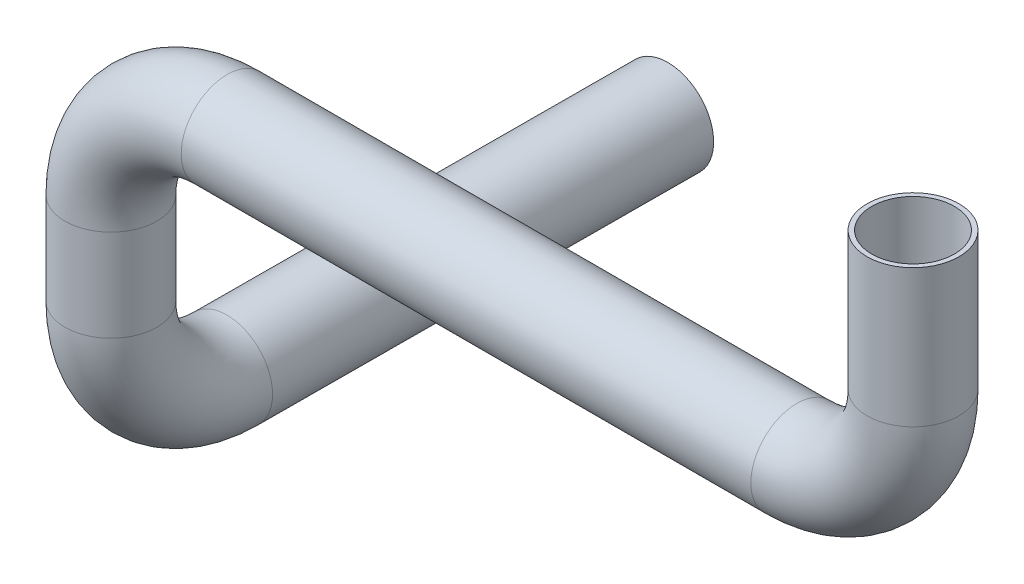
ISO-10303-21;
HEADER;
FILE_DESCRIPTION(('STEP AP214'),'2;1');
FILE_NAME('part.step','',(''),(''),'','','');
FILE_SCHEMA(('AUTOMOTIVE_DESIGN { 1 0 10303 214 1 1 1 1 }'));
ENDSEC;
DATA;
#1=APPLICATION_CONTEXT('core data for automotive mechanical design processes');
#2=APPLICATION_PROTOCOL_DEFINITION('international standard','automotive_design',2000,#1);
#3=PRODUCT_CONTEXT('',#1,'mechanical');
#4=PRODUCT('Part','Part','',(#3));
#5=PRODUCT_RELATED_PRODUCT_CATEGORY('part','',(#4));
#6=PRODUCT_DEFINITION_FORMATION('','',#4);
#7=PRODUCT_DEFINITION_CONTEXT('part definition',#1,'design');
#8=PRODUCT_DEFINITION('design','',#6,#7);
#9=PRODUCT_DEFINITION_SHAPE('','',#8);
#10=(LENGTH_UNIT() NAMED_UNIT(*) SI_UNIT(.MILLI.,.METRE.));
#11=(NAMED_UNIT(*) PLANE_ANGLE_UNIT() SI_UNIT($,.RADIAN.));
#12=(NAMED_UNIT(*) SI_UNIT($,.STERADIAN.) SOLID_ANGLE_UNIT());
#13=UNCERTAINTY_MEASURE_WITH_UNIT(LENGTH_MEASURE(1.E-05),#10,'distance_accuracy_value','');
#14=(GEOMETRIC_REPRESENTATION_CONTEXT(3) GLOBAL_UNCERTAINTY_ASSIGNED_CONTEXT((#13)) GLOBAL_UNIT_ASSIGNED_CONTEXT((#10,
#11,#12)) REPRESENTATION_CONTEXT('',''));
#15=CARTESIAN_POINT('',(0.,0.,0.));
#16=DIRECTION('',(0.,0.,1.));
#17=DIRECTION('',(1.,0.,0.));
#18=AXIS2_PLACEMENT_3D('',#15,#16,#17);
#19=CARTESIAN_POINT('',(87.3,50.3,0.));
#20=DIRECTION('',(0.,1.,0.));
#21=DIRECTION('',(0.,0.,1.));
#22=AXIS2_PLACEMENT_3D('',#19,#20,#21);
#23=PLANE('',#22);
#24=CARTESIAN_POINT('',(87.3,50.3,0.));
#25=DIRECTION('',(0.,1.,0.));
#26=DIRECTION('',(0.,0.,1.));
#27=AXIS2_PLACEMENT_3D('',#24,#25,#26);
#28=CIRCLE('',#27,4.5);
#29=CARTESIAN_POINT('',(87.3,50.3,4.5));
#30=VERTEX_POINT('',#29);
#31=EDGE_CURVE('E62',#30,#30,#28,.T.);
#32=ORIENTED_EDGE('',*,*,#31,.F.);
#33=EDGE_LOOP('',(#32));
#34=FACE_BOUND('',#33,.T.);
#35=CARTESIAN_POINT('',(87.3,50.3,0.));
#36=DIRECTION('',(0.,1.,0.));
#37=DIRECTION('',(0.,0.,1.));
#38=AXIS2_PLACEMENT_3D('',#35,#36,#37);
#39=CIRCLE('',#38,5.);
#40=CARTESIAN_POINT('',(87.3,50.3,5.));
#41=VERTEX_POINT('',#40);
#42=EDGE_CURVE('E10',#41,#41,#39,.T.);
#43=ORIENTED_EDGE('',*,*,#42,.T.);
#44=EDGE_LOOP('',(#43));
#45=FACE_BOUND('',#44,.T.);
#46=ADVANCED_FACE('F31',(#34,#45),#23,.T.);
#47=CARTESIAN_POINT('',(0.,0.,0.));
#48=DIRECTION('',(0.,1.,0.));
#49=DIRECTION('',(0.,0.,1.));
#50=AXIS2_PLACEMENT_3D('',#47,#48,#49);
#51=CYLINDRICAL_SURFACE('',#50,5.);
#52=CARTESIAN_POINT('',(0.,10.,0.));
#53=DIRECTION('',(0.,1.,0.));
#54=DIRECTION('',(0.,0.,1.));
#55=AXIS2_PLACEMENT_3D('',#52,#53,#54);
#56=CIRCLE('',#55,5.);
#57=CARTESIAN_POINT('',(-5.,10.,0.));
#58=VERTEX_POINT('',#57);
#59=EDGE_CURVE('E50',#58,#58,#56,.T.);
#60=ORIENTED_EDGE('',*,*,#59,.F.);
#61=EDGE_LOOP('',(#60));
#62=FACE_BOUND('',#61,.T.);
#63=CARTESIAN_POINT('',(0.,0.,0.));
#64=DIRECTION('',(0.,-1.,0.));
#65=DIRECTION('',(0.,0.,-1.));
#66=AXIS2_PLACEMENT_3D('',#63,#64,#65);
#67=CIRCLE('',#66,5.);
#68=CARTESIAN_POINT('',(0.,0.,5.));
#69=VERTEX_POINT('',#68);
#70=EDGE_CURVE('E59',#69,#69,#67,.T.);
#71=ORIENTED_EDGE('',*,*,#70,.F.);
#72=EDGE_LOOP('',(#71));
#73=FACE_BOUND('',#72,.T.);
#74=ADVANCED_FACE('F128',(#62,#73),#51,.T.);
#75=CARTESIAN_POINT('',(12.65,10.,0.));
#76=DIRECTION('',(0.,0.,-1.));
#77=DIRECTION('',(-1.,0.,0.));
#78=AXIS2_PLACEMENT_3D('',#75,#76,#77);
#79=TOROIDAL_SURFACE('',#78,12.65,5.);
#80=CARTESIAN_POINT('',(12.65,22.65,0.));
#81=DIRECTION('',(1.,0.,0.));
#82=DIRECTION('',(0.,0.,1.));
#83=AXIS2_PLACEMENT_3D('',#80,#81,#82);
#84=CIRCLE('',#83,5.);
#85=CARTESIAN_POINT('',(12.65,27.65,0.));
#86=VERTEX_POINT('',#85);
#87=EDGE_CURVE('E45',#86,#86,#84,.T.);
#88=CARTESIAN_POINT('',(12.65,10.,0.));
#89=DIRECTION('',(0.,0.,-1.));
#90=DIRECTION('',(-1.,0.,0.));
#91=AXIS2_PLACEMENT_3D('',#88,#89,#90);
#92=CIRCLE('',#91,17.65);
#93=EDGE_CURVE('',#58,#86,#92,.T.);
#94=ORIENTED_EDGE('',*,*,#59,.T.);
#95=ORIENTED_EDGE('',*,*,#87,.F.);
#96=ORIENTED_EDGE('',*,*,#93,.T.);
#97=ORIENTED_EDGE('',*,*,#93,.F.);
#98=EDGE_LOOP('',(#94,#96,#95,#97));
#99=FACE_BOUND('',#98,.T.);
#100=ADVANCED_FACE('F124',(#99),#79,.T.);
#101=CARTESIAN_POINT('',(12.65,22.65,0.));
#102=DIRECTION('',(1.,0.,0.));
#103=DIRECTION('',(0.,1.,0.));
#104=AXIS2_PLACEMENT_3D('',#101,#102,#103);
#105=CYLINDRICAL_SURFACE('',#104,5.);
#106=CARTESIAN_POINT('',(74.65,22.65,0.));
#107=DIRECTION('',(1.,0.,0.));
#108=DIRECTION('',(0.,0.,1.));
#109=AXIS2_PLACEMENT_3D('',#106,#107,#108);
#110=CIRCLE('',#109,5.);
#111=CARTESIAN_POINT('',(74.65,17.65,0.));
#112=VERTEX_POINT('',#111);
#113=EDGE_CURVE('E41',#112,#112,#110,.T.);
#114=ORIENTED_EDGE('',*,*,#113,.F.);
#115=EDGE_LOOP('',(#114));
#116=FACE_BOUND('',#115,.T.);
#117=ORIENTED_EDGE('',*,*,#87,.T.);
#118=EDGE_LOOP('',(#117));
#119=FACE_BOUND('',#118,.T.);
#120=ADVANCED_FACE('F118',(#116,#119),#105,.T.);
#121=CARTESIAN_POINT('',(74.65,35.3,0.));
#122=DIRECTION('',(0.,0.,1.));
#123=DIRECTION('',(1.,0.,0.));
#124=AXIS2_PLACEMENT_3D('',#121,#122,#123);
#125=TOROIDAL_SURFACE('',#124,12.65,5.);
#126=CARTESIAN_POINT('',(87.3,35.3,0.));
#127=DIRECTION('',(0.,1.,0.));
#128=DIRECTION('',(0.,0.,1.));
#129=AXIS2_PLACEMENT_3D('',#126,#127,#128);
#130=CIRCLE('',#129,5.);
#131=CARTESIAN_POINT('',(92.3,35.3,0.));
#132=VERTEX_POINT('',#131);
#133=EDGE_CURVE('E37',#132,#132,#130,.T.);
#134=CARTESIAN_POINT('',(74.65,35.3,0.));
#135=DIRECTION('',(0.,0.,1.));
#136=DIRECTION('',(1.,0.,0.));
#137=AXIS2_PLACEMENT_3D('',#134,#135,#136);
#138=CIRCLE('',#137,17.65);
#139=EDGE_CURVE('',#112,#132,#138,.T.);
#140=ORIENTED_EDGE('',*,*,#113,.T.);
#141=ORIENTED_EDGE('',*,*,#133,.F.);
#142=ORIENTED_EDGE('',*,*,#139,.T.);
#143=ORIENTED_EDGE('',*,*,#139,.F.);
#144=EDGE_LOOP('',(#140,#142,#141,#143));
#145=FACE_BOUND('',#144,.T.);
#146=ADVANCED_FACE('F108',(#145),#125,.T.);
#147=CARTESIAN_POINT('',(87.3,35.3,0.));
#148=DIRECTION('',(0.,1.,0.));
#149=DIRECTION('',(0.,0.,1.));
#150=AXIS2_PLACEMENT_3D('',#147,#148,#149);
#151=CYLINDRICAL_SURFACE('',#150,5.);
#152=ORIENTED_EDGE('',*,*,#42,.F.);
#153=EDGE_LOOP('',(#152));
#154=FACE_BOUND('',#153,.T.);
#155=ORIENTED_EDGE('',*,*,#133,.T.);
#156=EDGE_LOOP('',(#155));
#157=FACE_BOUND('',#156,.T.);
#158=ADVANCED_FACE('F105',(#154,#157),#151,.T.);
#159=CARTESIAN_POINT('',(0.,-12.8478140730482,-60.5978398523667));
#160=DIRECTION('',(0.,-0.00412333182871531,-0.999991499031182));
#161=DIRECTION('',(0.,0.999991499031182,-0.00412333182871531));
#162=AXIS2_PLACEMENT_3D('',#159,#160,#161);
#163=PLANE('',#162);
#164=CARTESIAN_POINT('',(0.,-12.8478140730482,-60.5978398523667));
#165=DIRECTION('',(0.,-0.00412333182871531,-0.999991499031182));
#166=DIRECTION('',(0.,0.999991499031182,-0.00412333182871531));
#167=AXIS2_PLACEMENT_3D('',#164,#165,#166);
#168=CIRCLE('',#167,4.5);
#169=CARTESIAN_POINT('',(0.,-8.34785232740791,-60.616394845596));
#170=VERTEX_POINT('',#169);
#171=EDGE_CURVE('E63',#170,#170,#168,.T.);
#172=ORIENTED_EDGE('',*,*,#171,.F.);
#173=EDGE_LOOP('',(#172));
#174=FACE_BOUND('',#173,.T.);
#175=CARTESIAN_POINT('',(0.,-12.8478140730482,-60.5978398523667));
#176=DIRECTION('',(0.,-0.00412333182871531,-0.999991499031182));
#177=DIRECTION('',(0.,0.999991499031182,-0.00412333182871531));
#178=AXIS2_PLACEMENT_3D('',#175,#176,#177);
#179=CIRCLE('',#178,5.);
#180=CARTESIAN_POINT('',(0.,-7.84785657789232,-60.6184565115103));
#181=VERTEX_POINT('',#180);
#182=EDGE_CURVE('E53',#181,#181,#179,.T.);
#183=ORIENTED_EDGE('',*,*,#182,.T.);
#184=EDGE_LOOP('',(#183));
#185=FACE_BOUND('',#184,.T.);
#186=ADVANCED_FACE('F107',(#174,#185),#163,.T.);
#187=CARTESIAN_POINT('',(0.,0.,-12.65));
#188=DIRECTION('',(1.,0.,0.));
#189=DIRECTION('',(0.,0.,-1.));
#190=AXIS2_PLACEMENT_3D('',#187,#188,#189);
#191=TOROIDAL_SURFACE('',#190,12.65,5.);
#192=CARTESIAN_POINT('',(0.,-12.6498924627445,-12.5978398523667));
#193=DIRECTION('',(0.,-0.00412333182871599,-0.999991499031182));
#194=DIRECTION('',(0.,0.999991499031182,-0.00412333182871599));
#195=AXIS2_PLACEMENT_3D('',#192,#193,#194);
#196=CIRCLE('',#195,5.);
#197=CARTESIAN_POINT('',(0.,-17.6498499579004,-12.5772231932232));
#198=VERTEX_POINT('',#197);
#199=EDGE_CURVE('E56',#198,#198,#196,.T.);
#200=CARTESIAN_POINT('',(0.,0.,-12.65));
#201=DIRECTION('',(1.,0.,0.));
#202=DIRECTION('',(0.,0.,-1.));
#203=AXIS2_PLACEMENT_3D('',#200,#201,#202);
#204=CIRCLE('',#203,17.65);
#205=EDGE_CURVE('',#69,#198,#204,.T.);
#206=ORIENTED_EDGE('',*,*,#70,.T.);
#207=ORIENTED_EDGE('',*,*,#199,.F.);
#208=ORIENTED_EDGE('',*,*,#205,.T.);
#209=ORIENTED_EDGE('',*,*,#205,.F.);
#210=EDGE_LOOP('',(#206,#208,#207,#209));
#211=FACE_BOUND('',#210,.T.);
#212=ADVANCED_FACE('F114',(#211),#191,.T.);
#213=CARTESIAN_POINT('',(0.,-12.6498924627445,-12.5978398523667));
#214=DIRECTION('',(0.,-0.00412333182871543,-0.999991499031182));
#215=DIRECTION('',(0.,0.999991499031182,-0.00412333182871543));
#216=AXIS2_PLACEMENT_3D('',#213,#214,#215);
#217=CYLINDRICAL_SURFACE('',#216,5.);
#218=ORIENTED_EDGE('',*,*,#182,.F.);
#219=EDGE_LOOP('',(#218));
#220=FACE_BOUND('',#219,.T.);
#221=ORIENTED_EDGE('',*,*,#199,.T.);
#222=EDGE_LOOP('',(#221));
#223=FACE_BOUND('',#222,.T.);
#224=ADVANCED_FACE('F102',(#220,#223),#217,.T.);
#225=CARTESIAN_POINT('',(0.,0.,0.));
#226=DIRECTION('',(0.,1.,0.));
#227=DIRECTION('',(0.,0.,1.));
#228=AXIS2_PLACEMENT_3D('',#225,#226,#227);
#229=CYLINDRICAL_SURFACE('',#228,4.5);
#230=CARTESIAN_POINT('',(0.,10.,0.));
#231=DIRECTION('',(0.,-1.,0.));
#232=DIRECTION('',(0.,0.,-1.));
#233=AXIS2_PLACEMENT_3D('',#230,#231,#232);
#234=CIRCLE('',#233,4.5);
#235=CARTESIAN_POINT('',(-4.5,10.,0.));
#236=VERTEX_POINT('',#235);
#237=EDGE_CURVE('E66',#236,#236,#234,.F.);
#238=ORIENTED_EDGE('',*,*,#237,.T.);
#239=EDGE_LOOP('',(#238));
#240=FACE_BOUND('',#239,.T.);
#241=CARTESIAN_POINT('',(0.,0.,0.));
#242=DIRECTION('',(0.,1.,0.));
#243=DIRECTION('',(0.,0.,1.));
#244=AXIS2_PLACEMENT_3D('',#241,#242,#243);
#245=CIRCLE('',#244,4.5);
#246=CARTESIAN_POINT('',(0.,0.,4.5));
#247=VERTEX_POINT('',#246);
#248=EDGE_CURVE('E73',#247,#247,#245,.F.);
#249=ORIENTED_EDGE('',*,*,#248,.T.);
#250=EDGE_LOOP('',(#249));
#251=FACE_BOUND('',#250,.T.);
#252=ADVANCED_FACE('F87',(#240,#251),#229,.F.);
#253=CARTESIAN_POINT('',(12.65,10.,0.));
#254=DIRECTION('',(0.,0.,-1.));
#255=DIRECTION('',(-1.,0.,0.));
#256=AXIS2_PLACEMENT_3D('',#253,#254,#255);
#257=TOROIDAL_SURFACE('',#256,12.65,4.5);
#258=CARTESIAN_POINT('',(12.65,22.65,0.));
#259=DIRECTION('',(1.,0.,0.));
#260=DIRECTION('',(0.,1.,0.));
#261=AXIS2_PLACEMENT_3D('',#258,#259,#260);
#262=CIRCLE('',#261,4.5);
#263=CARTESIAN_POINT('',(12.65,27.15,0.));
#264=VERTEX_POINT('',#263);
#265=EDGE_CURVE('E79',#264,#264,#262,.T.);
#266=CARTESIAN_POINT('',(12.65,10.,0.));
#267=DIRECTION('',(0.,0.,-1.));
#268=DIRECTION('',(-1.,0.,0.));
#269=AXIS2_PLACEMENT_3D('',#266,#267,#268);
#270=CIRCLE('',#269,17.15);
#271=EDGE_CURVE('',#236,#264,#270,.T.);
#272=ORIENTED_EDGE('',*,*,#237,.F.);
#273=ORIENTED_EDGE('',*,*,#265,.T.);
#274=ORIENTED_EDGE('',*,*,#271,.T.);
#275=ORIENTED_EDGE('',*,*,#271,.F.);
#276=EDGE_LOOP('',(#272,#274,#273,#275));
#277=FACE_BOUND('',#276,.T.);
#278=ADVANCED_FACE('F90',(#277),#257,.F.);
#279=CARTESIAN_POINT('',(12.65,22.65,0.));
#280=DIRECTION('',(1.,0.,0.));
#281=DIRECTION('',(0.,1.,0.));
#282=AXIS2_PLACEMENT_3D('',#279,#280,#281);
#283=CYLINDRICAL_SURFACE('',#282,4.5);
#284=CARTESIAN_POINT('',(74.65,22.65,0.));
#285=DIRECTION('',(-1.,0.,0.));
#286=DIRECTION('',(0.,-1.,0.));
#287=AXIS2_PLACEMENT_3D('',#284,#285,#286);
#288=CIRCLE('',#287,4.5);
#289=CARTESIAN_POINT('',(74.65,18.15,0.));
#290=VERTEX_POINT('',#289);
#291=EDGE_CURVE('E76',#290,#290,#288,.F.);
#292=ORIENTED_EDGE('',*,*,#291,.T.);
#293=EDGE_LOOP('',(#292));
#294=FACE_BOUND('',#293,.T.);
#295=ORIENTED_EDGE('',*,*,#265,.F.);
#296=EDGE_LOOP('',(#295));
#297=FACE_BOUND('',#296,.T.);
#298=ADVANCED_FACE('F92',(#294,#297),#283,.F.);
#299=CARTESIAN_POINT('',(74.65,35.3,0.));
#300=DIRECTION('',(0.,0.,1.));
#301=DIRECTION('',(1.,0.,0.));
#302=AXIS2_PLACEMENT_3D('',#299,#300,#301);
#303=TOROIDAL_SURFACE('',#302,12.65,4.5);
#304=CARTESIAN_POINT('',(87.3,35.3,0.));
#305=DIRECTION('',(0.,1.,0.));
#306=DIRECTION('',(0.,0.,1.));
#307=AXIS2_PLACEMENT_3D('',#304,#305,#306);
#308=CIRCLE('',#307,4.5);
#309=CARTESIAN_POINT('',(91.8,35.3,0.));
#310=VERTEX_POINT('',#309);
#311=EDGE_CURVE('E70',#310,#310,#308,.T.);
#312=CARTESIAN_POINT('',(74.65,35.3,0.));
#313=DIRECTION('',(0.,0.,1.));
#314=DIRECTION('',(1.,0.,0.));
#315=AXIS2_PLACEMENT_3D('',#312,#313,#314);
#316=CIRCLE('',#315,17.15);
#317=EDGE_CURVE('',#290,#310,#316,.T.);
#318=ORIENTED_EDGE('',*,*,#291,.F.);
#319=ORIENTED_EDGE('',*,*,#311,.T.);
#320=ORIENTED_EDGE('',*,*,#317,.T.);
#321=ORIENTED_EDGE('',*,*,#317,.F.);
#322=EDGE_LOOP('',(#318,#320,#319,#321));
#323=FACE_BOUND('',#322,.T.);
#324=ADVANCED_FACE('F99',(#323),#303,.F.);
#325=CARTESIAN_POINT('',(87.3,35.3,0.));
#326=DIRECTION('',(0.,1.,0.));
#327=DIRECTION('',(0.,0.,1.));
#328=AXIS2_PLACEMENT_3D('',#325,#326,#327);
#329=CYLINDRICAL_SURFACE('',#328,4.5);
#330=ORIENTED_EDGE('',*,*,#31,.T.);
#331=EDGE_LOOP('',(#330));
#332=FACE_BOUND('',#331,.T.);
#333=ORIENTED_EDGE('',*,*,#311,.F.);
#334=EDGE_LOOP('',(#333));
#335=FACE_BOUND('',#334,.T.);
#336=ADVANCED_FACE('F117',(#332,#335),#329,.F.);
#337=CARTESIAN_POINT('',(0.,0.,-12.65));
#338=DIRECTION('',(1.,0.,0.));
#339=DIRECTION('',(0.,0.,-1.));
#340=AXIS2_PLACEMENT_3D('',#337,#338,#339);
#341=TOROIDAL_SURFACE('',#340,12.65,4.5);
#342=CARTESIAN_POINT('',(0.,-12.6498924627445,-12.5978398523667));
#343=DIRECTION('',(0.,-0.00412333182871543,-0.999991499031182));
#344=DIRECTION('',(0.,0.999991499031182,-0.00412333182871543));
#345=AXIS2_PLACEMENT_3D('',#342,#343,#344);
#346=CIRCLE('',#345,4.5);
#347=CARTESIAN_POINT('',(0.,-17.1498542083848,-12.5792848591375));
#348=VERTEX_POINT('',#347);
#349=EDGE_CURVE('E67',#348,#348,#346,.T.);
#350=CARTESIAN_POINT('',(0.,0.,-12.65));
#351=DIRECTION('',(1.,0.,0.));
#352=DIRECTION('',(0.,0.,-1.));
#353=AXIS2_PLACEMENT_3D('',#350,#351,#352);
#354=CIRCLE('',#353,17.15);
#355=EDGE_CURVE('',#247,#348,#354,.T.);
#356=ORIENTED_EDGE('',*,*,#248,.F.);
#357=ORIENTED_EDGE('',*,*,#349,.T.);
#358=ORIENTED_EDGE('',*,*,#355,.T.);
#359=ORIENTED_EDGE('',*,*,#355,.F.);
#360=EDGE_LOOP('',(#356,#358,#357,#359));
#361=FACE_BOUND('',#360,.T.);
#362=ADVANCED_FACE('F141',(#361),#341,.F.);
#363=CARTESIAN_POINT('',(0.,-12.6498924627445,-12.5978398523667));
#364=DIRECTION('',(0.,-0.00412333182871543,-0.999991499031182));
#365=DIRECTION('',(0.,0.999991499031182,-0.00412333182871543));
#366=AXIS2_PLACEMENT_3D('',#363,#364,#365);
#367=CYLINDRICAL_SURFACE('',#366,4.5);
#368=ORIENTED_EDGE('',*,*,#171,.T.);
#369=EDGE_LOOP('',(#368));
#370=FACE_BOUND('',#369,.T.);
#371=ORIENTED_EDGE('',*,*,#349,.F.);
#372=EDGE_LOOP('',(#371));
#373=FACE_BOUND('',#372,.T.);
#374=ADVANCED_FACE('F104',(#370,#373),#367,.F.);
#375=CLOSED_SHELL('',(#46,#74,#100,#120,#146,#158,#186,#212,#224,#252,#278,#298,#324,#336,#362,#374));
#376=MANIFOLD_SOLID_BREP('B2',#375);
#377=ADVANCED_BREP_SHAPE_REPRESENTATION('',(#18,#376),#14);
#378=SHAPE_DEFINITION_REPRESENTATION(#9,#377);
ENDSEC;
END-ISO-10303-21;
